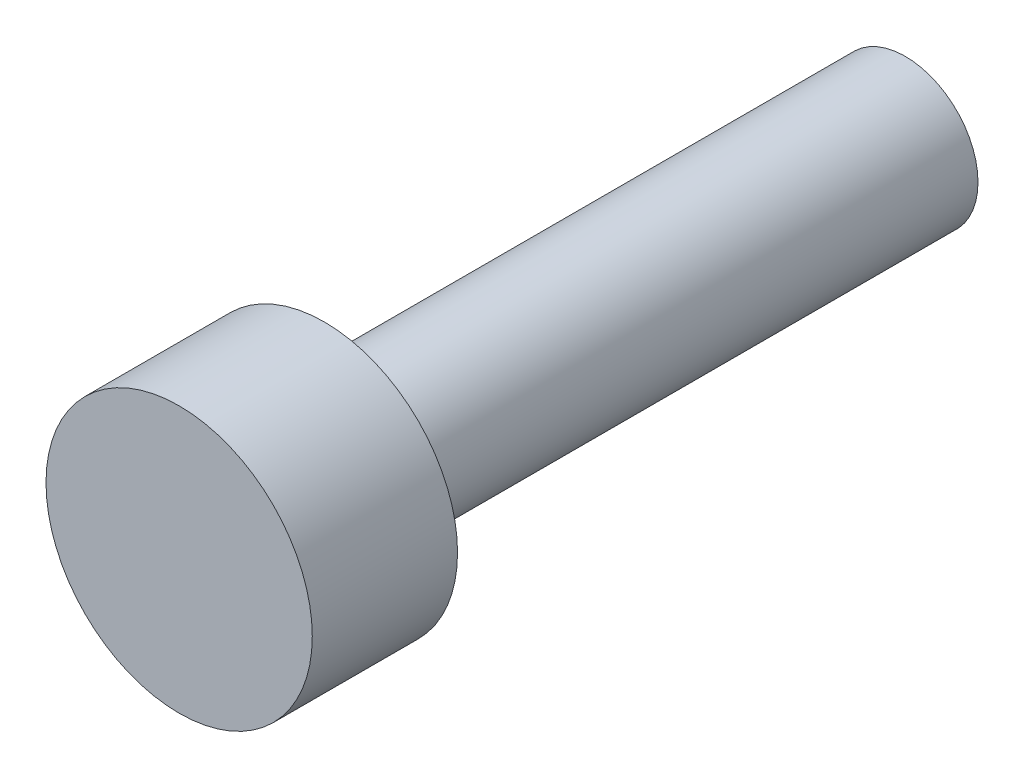
ISO-10303-21;
HEADER;
FILE_DESCRIPTION(('STEP AP214'),'2;1');
FILE_NAME('part.step','',(''),(''),'','','');
FILE_SCHEMA(('AUTOMOTIVE_DESIGN { 1 0 10303 214 1 1 1 1 }'));
ENDSEC;
DATA;
#1=APPLICATION_CONTEXT('core data for automotive mechanical design processes');
#2=APPLICATION_PROTOCOL_DEFINITION('international standard','automotive_design',2000,#1);
#3=PRODUCT_CONTEXT('',#1,'mechanical');
#4=PRODUCT('Part','Part','',(#3));
#5=PRODUCT_RELATED_PRODUCT_CATEGORY('part','',(#4));
#6=PRODUCT_DEFINITION_FORMATION('','',#4);
#7=PRODUCT_DEFINITION_CONTEXT('part definition',#1,'design');
#8=PRODUCT_DEFINITION('design','',#6,#7);
#9=PRODUCT_DEFINITION_SHAPE('','',#8);
#10=(LENGTH_UNIT() NAMED_UNIT(*) SI_UNIT(.MILLI.,.METRE.));
#11=(NAMED_UNIT(*) PLANE_ANGLE_UNIT() SI_UNIT($,.RADIAN.));
#12=(NAMED_UNIT(*) SI_UNIT($,.STERADIAN.) SOLID_ANGLE_UNIT());
#13=UNCERTAINTY_MEASURE_WITH_UNIT(LENGTH_MEASURE(1.E-05),#10,'distance_accuracy_value','');
#14=(GEOMETRIC_REPRESENTATION_CONTEXT(3) GLOBAL_UNCERTAINTY_ASSIGNED_CONTEXT((#13)) GLOBAL_UNIT_ASSIGNED_CONTEXT((#10,
#11,#12)) REPRESENTATION_CONTEXT('',''));
#15=CARTESIAN_POINT('',(0.,0.,0.));
#16=DIRECTION('',(0.,0.,1.));
#17=DIRECTION('',(1.,0.,0.));
#18=AXIS2_PLACEMENT_3D('',#15,#16,#17);
#19=CARTESIAN_POINT('',(0.,0.,12.));
#20=DIRECTION('',(0.,0.,-1.));
#21=DIRECTION('',(-1.,0.,0.));
#22=AXIS2_PLACEMENT_3D('',#19,#20,#21);
#23=CYLINDRICAL_SURFACE('',#22,1.5);
#24=CARTESIAN_POINT('',(0.,0.,12.));
#25=DIRECTION('',(0.,0.,1.));
#26=DIRECTION('',(1.,0.,0.));
#27=AXIS2_PLACEMENT_3D('',#24,#25,#26);
#28=CIRCLE('',#27,1.5);
#29=CARTESIAN_POINT('',(1.5,0.,12.));
#30=VERTEX_POINT('',#29);
#31=EDGE_CURVE('E10',#30,#30,#28,.T.);
#32=ORIENTED_EDGE('',*,*,#31,.F.);
#33=EDGE_LOOP('',(#32));
#34=FACE_BOUND('',#33,.T.);
#35=CARTESIAN_POINT('',(0.,0.,0.));
#36=DIRECTION('',(0.,0.,1.));
#37=DIRECTION('',(1.,0.,0.));
#38=AXIS2_PLACEMENT_3D('',#35,#36,#37);
#39=CIRCLE('',#38,1.5);
#40=CARTESIAN_POINT('',(1.5,0.,0.));
#41=VERTEX_POINT('',#40);
#42=EDGE_CURVE('E34',#41,#41,#39,.T.);
#43=ORIENTED_EDGE('',*,*,#42,.T.);
#44=EDGE_LOOP('',(#43));
#45=FACE_BOUND('',#44,.T.);
#46=ADVANCED_FACE('F31',(#34,#45),#23,.T.);
#47=CARTESIAN_POINT('',(0.,0.,0.));
#48=DIRECTION('',(0.,0.,1.));
#49=DIRECTION('',(1.,0.,0.));
#50=AXIS2_PLACEMENT_3D('',#47,#48,#49);
#51=PLANE('',#50);
#52=ORIENTED_EDGE('',*,*,#42,.F.);
#53=EDGE_LOOP('',(#52));
#54=FACE_BOUND('',#53,.T.);
#55=ADVANCED_FACE('F54',(#54),#51,.F.);
#56=CARTESIAN_POINT('',(0.,0.,15.));
#57=DIRECTION('',(0.,0.,-1.));
#58=DIRECTION('',(-1.,0.,0.));
#59=AXIS2_PLACEMENT_3D('',#56,#57,#58);
#60=CYLINDRICAL_SURFACE('',#59,2.75);
#61=CARTESIAN_POINT('',(0.,0.,15.));
#62=DIRECTION('',(0.,0.,1.));
#63=DIRECTION('',(1.,0.,0.));
#64=AXIS2_PLACEMENT_3D('',#61,#62,#63);
#65=CIRCLE('',#64,2.75);
#66=CARTESIAN_POINT('',(2.75,0.,15.));
#67=VERTEX_POINT('',#66);
#68=EDGE_CURVE('E41',#67,#67,#65,.T.);
#69=ORIENTED_EDGE('',*,*,#68,.F.);
#70=EDGE_LOOP('',(#69));
#71=FACE_BOUND('',#70,.T.);
#72=CARTESIAN_POINT('',(0.,0.,12.));
#73=DIRECTION('',(0.,0.,1.));
#74=DIRECTION('',(1.,0.,0.));
#75=AXIS2_PLACEMENT_3D('',#72,#73,#74);
#76=CIRCLE('',#75,2.75);
#77=CARTESIAN_POINT('',(2.75,0.,12.));
#78=VERTEX_POINT('',#77);
#79=EDGE_CURVE('E43',#78,#78,#76,.T.);
#80=ORIENTED_EDGE('',*,*,#79,.T.);
#81=EDGE_LOOP('',(#80));
#82=FACE_BOUND('',#81,.T.);
#83=ADVANCED_FACE('F51',(#71,#82),#60,.T.);
#84=CARTESIAN_POINT('',(0.,0.,15.));
#85=DIRECTION('',(0.,0.,1.));
#86=DIRECTION('',(1.,0.,0.));
#87=AXIS2_PLACEMENT_3D('',#84,#85,#86);
#88=PLANE('',#87);
#89=ORIENTED_EDGE('',*,*,#68,.T.);
#90=EDGE_LOOP('',(#89));
#91=FACE_BOUND('',#90,.T.);
#92=ADVANCED_FACE('F49',(#91),#88,.T.);
#93=CARTESIAN_POINT('',(0.,0.,12.));
#94=DIRECTION('',(0.,0.,1.));
#95=DIRECTION('',(1.,0.,0.));
#96=AXIS2_PLACEMENT_3D('',#93,#94,#95);
#97=PLANE('',#96);
#98=ORIENTED_EDGE('',*,*,#31,.T.);
#99=EDGE_LOOP('',(#98));
#100=FACE_BOUND('',#99,.T.);
#101=ORIENTED_EDGE('',*,*,#79,.F.);
#102=EDGE_LOOP('',(#101));
#103=FACE_BOUND('',#102,.T.);
#104=ADVANCED_FACE('F58',(#100,#103),#97,.F.);
#105=CLOSED_SHELL('',(#46,#55,#83,#92,#104));
#106=MANIFOLD_SOLID_BREP('B2',#105);
#107=ADVANCED_BREP_SHAPE_REPRESENTATION('',(#18,#106),#14);
#108=SHAPE_DEFINITION_REPRESENTATION(#9,#107);
ENDSEC;
END-ISO-10303-21;
